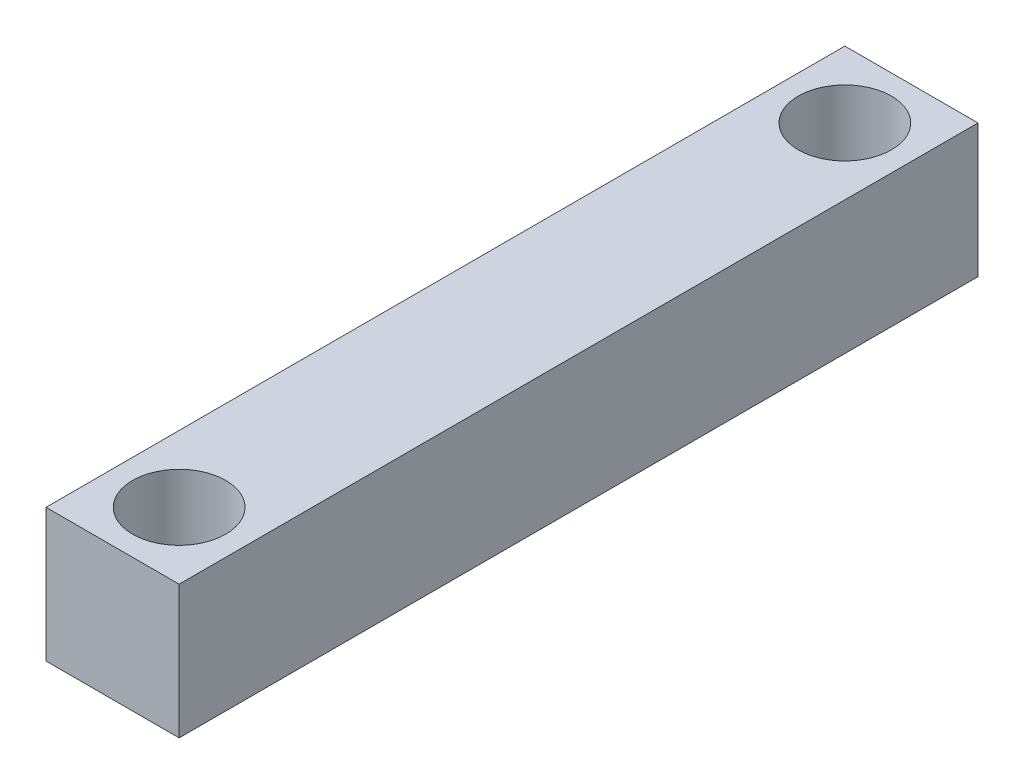
ISO-10303-21;
HEADER;
FILE_DESCRIPTION(('STEP AP214'),'2;1');
FILE_NAME('part.step','',(''),(''),'','','');
FILE_SCHEMA(('AUTOMOTIVE_DESIGN { 1 0 10303 214 1 1 1 1 }'));
ENDSEC;
DATA;
#1=APPLICATION_CONTEXT('core data for automotive mechanical design processes');
#2=APPLICATION_PROTOCOL_DEFINITION('international standard','automotive_design',2000,#1);
#3=PRODUCT_CONTEXT('',#1,'mechanical');
#4=PRODUCT('Part','Part','',(#3));
#5=PRODUCT_RELATED_PRODUCT_CATEGORY('part','',(#4));
#6=PRODUCT_DEFINITION_FORMATION('','',#4);
#7=PRODUCT_DEFINITION_CONTEXT('part definition',#1,'design');
#8=PRODUCT_DEFINITION('design','',#6,#7);
#9=PRODUCT_DEFINITION_SHAPE('','',#8);
#10=(LENGTH_UNIT() NAMED_UNIT(*) SI_UNIT(.MILLI.,.METRE.));
#11=(NAMED_UNIT(*) PLANE_ANGLE_UNIT() SI_UNIT($,.RADIAN.));
#12=(NAMED_UNIT(*) SI_UNIT($,.STERADIAN.) SOLID_ANGLE_UNIT());
#13=UNCERTAINTY_MEASURE_WITH_UNIT(LENGTH_MEASURE(1.E-05),#10,'distance_accuracy_value','');
#14=(GEOMETRIC_REPRESENTATION_CONTEXT(3) GLOBAL_UNCERTAINTY_ASSIGNED_CONTEXT((#13)) GLOBAL_UNIT_ASSIGNED_CONTEXT((#10,
#11,#12)) REPRESENTATION_CONTEXT('',''));
#15=CARTESIAN_POINT('',(0.,0.,0.));
#16=DIRECTION('',(0.,0.,1.));
#17=DIRECTION('',(1.,0.,0.));
#18=AXIS2_PLACEMENT_3D('',#15,#16,#17);
#19=CARTESIAN_POINT('',(0.,5.,30.));
#20=DIRECTION('',(-1.,0.,0.));
#21=DIRECTION('',(0.,-1.,0.));
#22=AXIS2_PLACEMENT_3D('',#19,#20,#21);
#23=PLANE('',#22);
#24=DIRECTION('',(0.,1.,0.));
#25=VECTOR('',#24,1.);
#26=CARTESIAN_POINT('',(0.,5.,0.));
#27=LINE('',#26,#25);
#28=CARTESIAN_POINT('',(0.,0.,0.));
#29=VERTEX_POINT('',#28);
#30=CARTESIAN_POINT('',(0.,5.,0.));
#31=VERTEX_POINT('',#30);
#32=EDGE_CURVE('E96',#29,#31,#27,.T.);
#33=ORIENTED_EDGE('',*,*,#32,.T.);
#34=DIRECTION('',(0.,0.,-1.));
#35=VECTOR('',#34,1.);
#36=CARTESIAN_POINT('',(0.,5.,30.));
#37=LINE('',#36,#35);
#38=CARTESIAN_POINT('',(0.,5.,30.));
#39=VERTEX_POINT('',#38);
#40=EDGE_CURVE('E11',#39,#31,#37,.T.);
#41=ORIENTED_EDGE('',*,*,#40,.F.);
#42=DIRECTION('',(0.,1.,0.));
#43=VECTOR('',#42,1.);
#44=CARTESIAN_POINT('',(0.,5.,30.));
#45=LINE('',#44,#43);
#46=CARTESIAN_POINT('',(0.,0.,30.));
#47=VERTEX_POINT('',#46);
#48=EDGE_CURVE('E84',#47,#39,#45,.T.);
#49=ORIENTED_EDGE('',*,*,#48,.F.);
#50=DIRECTION('',(0.,0.,-1.));
#51=VECTOR('',#50,1.);
#52=CARTESIAN_POINT('',(0.,0.,30.));
#53=LINE('',#52,#51);
#54=EDGE_CURVE('E92',#47,#29,#53,.T.);
#55=ORIENTED_EDGE('',*,*,#54,.T.);
#56=EDGE_LOOP('',(#33,#41,#49,#55));
#57=FACE_BOUND('',#56,.T.);
#58=ADVANCED_FACE('F33',(#57),#23,.F.);
#59=CARTESIAN_POINT('',(-5.,5.,30.));
#60=DIRECTION('',(0.,-1.,0.));
#61=DIRECTION('',(0.,0.,-1.));
#62=AXIS2_PLACEMENT_3D('',#59,#60,#61);
#63=PLANE('',#62);
#64=CARTESIAN_POINT('',(-2.5,5.,2.5));
#65=DIRECTION('',(0.,-1.,0.));
#66=DIRECTION('',(1.,0.,0.));
#67=AXIS2_PLACEMENT_3D('',#64,#65,#66);
#68=CIRCLE('',#67,1.75);
#69=CARTESIAN_POINT('',(-0.750000000000001,5.,2.5));
#70=VERTEX_POINT('',#69);
#71=EDGE_CURVE('E113',#70,#70,#68,.T.);
#72=ORIENTED_EDGE('',*,*,#71,.T.);
#73=EDGE_LOOP('',(#72));
#74=FACE_BOUND('',#73,.T.);
#75=CARTESIAN_POINT('',(-2.5,5.,27.5));
#76=DIRECTION('',(0.,-1.,0.));
#77=DIRECTION('',(1.,0.,0.));
#78=AXIS2_PLACEMENT_3D('',#75,#76,#77);
#79=CIRCLE('',#78,1.75);
#80=CARTESIAN_POINT('',(-0.749999999999999,5.,27.5));
#81=VERTEX_POINT('',#80);
#82=EDGE_CURVE('E99',#81,#81,#79,.T.);
#83=ORIENTED_EDGE('',*,*,#82,.T.);
#84=EDGE_LOOP('',(#83));
#85=FACE_BOUND('',#84,.T.);
#86=DIRECTION('',(-1.,0.,0.));
#87=VECTOR('',#86,1.);
#88=CARTESIAN_POINT('',(-5.,5.,0.));
#89=LINE('',#88,#87);
#90=CARTESIAN_POINT('',(-5.,5.,0.));
#91=VERTEX_POINT('',#90);
#92=EDGE_CURVE('E88',#31,#91,#89,.T.);
#93=ORIENTED_EDGE('',*,*,#92,.T.);
#94=DIRECTION('',(0.,0.,-1.));
#95=VECTOR('',#94,1.);
#96=CARTESIAN_POINT('',(-5.,5.,30.));
#97=LINE('',#96,#95);
#98=CARTESIAN_POINT('',(-5.,5.,30.));
#99=VERTEX_POINT('',#98);
#100=EDGE_CURVE('E41',#99,#91,#97,.T.);
#101=ORIENTED_EDGE('',*,*,#100,.F.);
#102=DIRECTION('',(-1.,0.,0.));
#103=VECTOR('',#102,1.);
#104=CARTESIAN_POINT('',(-5.,5.,30.));
#105=LINE('',#104,#103);
#106=EDGE_CURVE('E79',#39,#99,#105,.T.);
#107=ORIENTED_EDGE('',*,*,#106,.F.);
#108=ORIENTED_EDGE('',*,*,#40,.T.);
#109=EDGE_LOOP('',(#93,#101,#107,#108));
#110=FACE_BOUND('',#109,.T.);
#111=ADVANCED_FACE('F87',(#74,#85,#110),#63,.F.);
#112=CARTESIAN_POINT('',(-5.,0.,30.));
#113=DIRECTION('',(1.,0.,0.));
#114=DIRECTION('',(0.,1.,0.));
#115=AXIS2_PLACEMENT_3D('',#112,#113,#114);
#116=PLANE('',#115);
#117=DIRECTION('',(0.,-1.,0.));
#118=VECTOR('',#117,1.);
#119=CARTESIAN_POINT('',(-5.,0.,0.));
#120=LINE('',#119,#118);
#121=CARTESIAN_POINT('',(-5.,0.,0.));
#122=VERTEX_POINT('',#121);
#123=EDGE_CURVE('E66',#91,#122,#120,.T.);
#124=ORIENTED_EDGE('',*,*,#123,.T.);
#125=DIRECTION('',(0.,0.,-1.));
#126=VECTOR('',#125,1.);
#127=CARTESIAN_POINT('',(-5.,0.,30.));
#128=LINE('',#127,#126);
#129=CARTESIAN_POINT('',(-5.,0.,30.));
#130=VERTEX_POINT('',#129);
#131=EDGE_CURVE('E89',#130,#122,#128,.T.);
#132=ORIENTED_EDGE('',*,*,#131,.F.);
#133=DIRECTION('',(0.,-1.,0.));
#134=VECTOR('',#133,1.);
#135=CARTESIAN_POINT('',(-5.,0.,30.));
#136=LINE('',#135,#134);
#137=EDGE_CURVE('E82',#99,#130,#136,.T.);
#138=ORIENTED_EDGE('',*,*,#137,.F.);
#139=ORIENTED_EDGE('',*,*,#100,.T.);
#140=EDGE_LOOP('',(#124,#132,#138,#139));
#141=FACE_BOUND('',#140,.T.);
#142=ADVANCED_FACE('F90',(#141),#116,.F.);
#143=CARTESIAN_POINT('',(0.,0.,30.));
#144=DIRECTION('',(0.,1.,0.));
#145=DIRECTION('',(-1.,0.,0.));
#146=AXIS2_PLACEMENT_3D('',#143,#144,#145);
#147=PLANE('',#146);
#148=CARTESIAN_POINT('',(-2.5,0.,2.5));
#149=DIRECTION('',(0.,-1.,0.));
#150=DIRECTION('',(1.,0.,0.));
#151=AXIS2_PLACEMENT_3D('',#148,#149,#150);
#152=CIRCLE('',#151,1.75);
#153=CARTESIAN_POINT('',(-0.75,0.,2.5));
#154=VERTEX_POINT('',#153);
#155=EDGE_CURVE('E116',#154,#154,#152,.T.);
#156=ORIENTED_EDGE('',*,*,#155,.F.);
#157=EDGE_LOOP('',(#156));
#158=FACE_BOUND('',#157,.T.);
#159=CARTESIAN_POINT('',(-2.5,0.,27.5));
#160=DIRECTION('',(0.,-1.,0.));
#161=DIRECTION('',(1.,0.,0.));
#162=AXIS2_PLACEMENT_3D('',#159,#160,#161);
#163=CIRCLE('',#162,1.75);
#164=CARTESIAN_POINT('',(-0.749999999999998,0.,27.5));
#165=VERTEX_POINT('',#164);
#166=EDGE_CURVE('E110',#165,#165,#163,.T.);
#167=ORIENTED_EDGE('',*,*,#166,.F.);
#168=EDGE_LOOP('',(#167));
#169=FACE_BOUND('',#168,.T.);
#170=DIRECTION('',(1.,0.,0.));
#171=VECTOR('',#170,1.);
#172=CARTESIAN_POINT('',(0.,0.,0.));
#173=LINE('',#172,#171);
#174=EDGE_CURVE('E72',#122,#29,#173,.T.);
#175=ORIENTED_EDGE('',*,*,#174,.T.);
#176=ORIENTED_EDGE('',*,*,#54,.F.);
#177=DIRECTION('',(1.,0.,0.));
#178=VECTOR('',#177,1.);
#179=CARTESIAN_POINT('',(0.,0.,30.));
#180=LINE('',#179,#178);
#181=EDGE_CURVE('E49',#130,#47,#180,.T.);
#182=ORIENTED_EDGE('',*,*,#181,.F.);
#183=ORIENTED_EDGE('',*,*,#131,.T.);
#184=EDGE_LOOP('',(#175,#176,#182,#183));
#185=FACE_BOUND('',#184,.T.);
#186=ADVANCED_FACE('F104',(#158,#169,#185),#147,.F.);
#187=CARTESIAN_POINT('',(0.,0.,30.));
#188=DIRECTION('',(0.,0.,-1.));
#189=DIRECTION('',(-1.,0.,0.));
#190=AXIS2_PLACEMENT_3D('',#187,#188,#189);
#191=PLANE('',#190);
#192=ORIENTED_EDGE('',*,*,#48,.T.);
#193=ORIENTED_EDGE('',*,*,#106,.T.);
#194=ORIENTED_EDGE('',*,*,#137,.T.);
#195=ORIENTED_EDGE('',*,*,#181,.T.);
#196=EDGE_LOOP('',(#192,#193,#194,#195));
#197=FACE_BOUND('',#196,.T.);
#198=ADVANCED_FACE('F80',(#197),#191,.F.);
#199=CARTESIAN_POINT('',(0.,0.,0.));
#200=DIRECTION('',(0.,0.,-1.));
#201=DIRECTION('',(-1.,0.,0.));
#202=AXIS2_PLACEMENT_3D('',#199,#200,#201);
#203=PLANE('',#202);
#204=ORIENTED_EDGE('',*,*,#32,.F.);
#205=ORIENTED_EDGE('',*,*,#174,.F.);
#206=ORIENTED_EDGE('',*,*,#123,.F.);
#207=ORIENTED_EDGE('',*,*,#92,.F.);
#208=EDGE_LOOP('',(#204,#205,#206,#207));
#209=FACE_BOUND('',#208,.T.);
#210=ADVANCED_FACE('F107',(#209),#203,.T.);
#211=CARTESIAN_POINT('',(-2.5,5.,27.5));
#212=DIRECTION('',(0.,-1.,0.));
#213=DIRECTION('',(1.,0.,0.));
#214=AXIS2_PLACEMENT_3D('',#211,#212,#213);
#215=CYLINDRICAL_SURFACE('',#214,1.75);
#216=ORIENTED_EDGE('',*,*,#82,.F.);
#217=EDGE_LOOP('',(#216));
#218=FACE_BOUND('',#217,.T.);
#219=ORIENTED_EDGE('',*,*,#166,.T.);
#220=EDGE_LOOP('',(#219));
#221=FACE_BOUND('',#220,.T.);
#222=ADVANCED_FACE('F127',(#218,#221),#215,.F.);
#223=CARTESIAN_POINT('',(-2.5,5.,2.5));
#224=DIRECTION('',(0.,-1.,0.));
#225=DIRECTION('',(1.,0.,0.));
#226=AXIS2_PLACEMENT_3D('',#223,#224,#225);
#227=CYLINDRICAL_SURFACE('',#226,1.75);
#228=ORIENTED_EDGE('',*,*,#71,.F.);
#229=EDGE_LOOP('',(#228));
#230=FACE_BOUND('',#229,.T.);
#231=ORIENTED_EDGE('',*,*,#155,.T.);
#232=EDGE_LOOP('',(#231));
#233=FACE_BOUND('',#232,.T.);
#234=ADVANCED_FACE('F124',(#230,#233),#227,.F.);
#235=CLOSED_SHELL('',(#58,#111,#142,#186,#198,#210,#222,#234));
#236=MANIFOLD_SOLID_BREP('B2',#235);
#237=ADVANCED_BREP_SHAPE_REPRESENTATION('',(#18,#236),#14);
#238=SHAPE_DEFINITION_REPRESENTATION(#9,#237);
ENDSEC;
END-ISO-10303-21;
